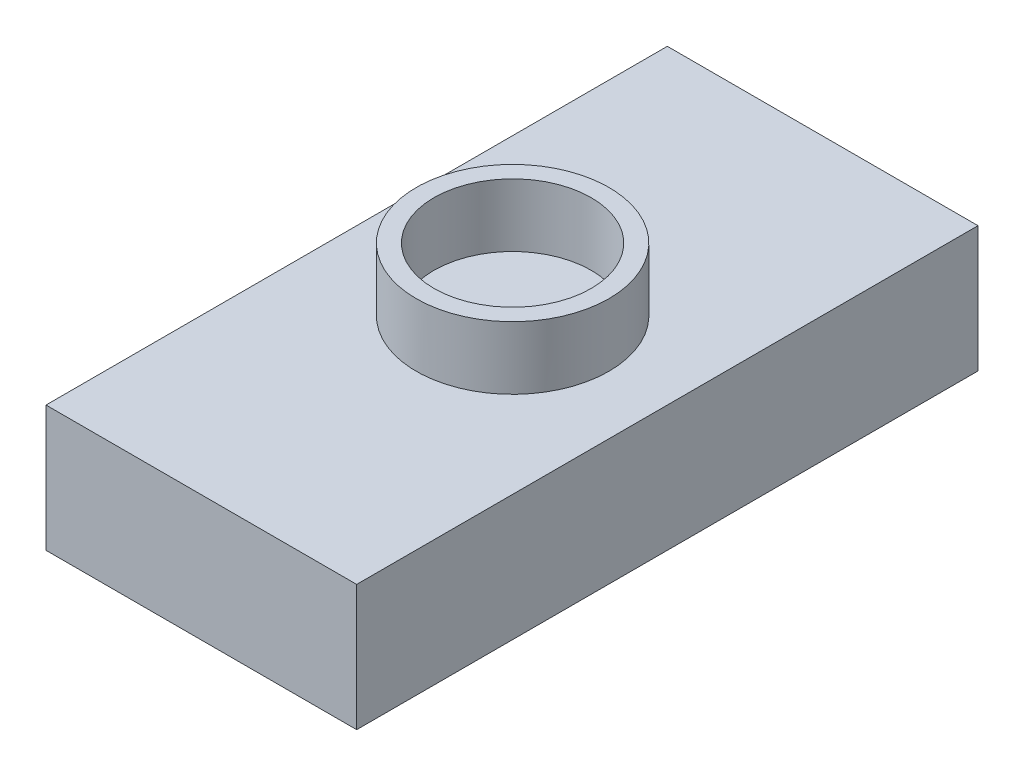
ISO-10303-21;
HEADER;
FILE_DESCRIPTION(('STEP AP214'),'2;1');
FILE_NAME('part.step','',(''),(''),'','','');
FILE_SCHEMA(('AUTOMOTIVE_DESIGN { 1 0 10303 214 1 1 1 1 }'));
ENDSEC;
DATA;
#1=APPLICATION_CONTEXT('core data for automotive mechanical design processes');
#2=APPLICATION_PROTOCOL_DEFINITION('international standard','automotive_design',2000,#1);
#3=PRODUCT_CONTEXT('',#1,'mechanical');
#4=PRODUCT('Part','Part','',(#3));
#5=PRODUCT_RELATED_PRODUCT_CATEGORY('part','',(#4));
#6=PRODUCT_DEFINITION_FORMATION('','',#4);
#7=PRODUCT_DEFINITION_CONTEXT('part definition',#1,'design');
#8=PRODUCT_DEFINITION('design','',#6,#7);
#9=PRODUCT_DEFINITION_SHAPE('','',#8);
#10=(LENGTH_UNIT() NAMED_UNIT(*) SI_UNIT(.MILLI.,.METRE.));
#11=(NAMED_UNIT(*) PLANE_ANGLE_UNIT() SI_UNIT($,.RADIAN.));
#12=(NAMED_UNIT(*) SI_UNIT($,.STERADIAN.) SOLID_ANGLE_UNIT());
#13=UNCERTAINTY_MEASURE_WITH_UNIT(LENGTH_MEASURE(1.E-05),#10,'distance_accuracy_value','');
#14=(GEOMETRIC_REPRESENTATION_CONTEXT(3) GLOBAL_UNCERTAINTY_ASSIGNED_CONTEXT((#13)) GLOBAL_UNIT_ASSIGNED_CONTEXT((#10,
#11,#12)) REPRESENTATION_CONTEXT('',''));
#15=CARTESIAN_POINT('',(0.,0.,0.));
#16=DIRECTION('',(0.,0.,1.));
#17=DIRECTION('',(1.,0.,0.));
#18=AXIS2_PLACEMENT_3D('',#15,#16,#17);
#19=CARTESIAN_POINT('',(1.88196721311474,0.,7.9));
#20=DIRECTION('',(1.,0.,0.));
#21=DIRECTION('',(0.,0.,-1.));
#22=AXIS2_PLACEMENT_3D('',#19,#20,#21);
#23=PLANE('',#22);
#24=DIRECTION('',(0.,0.,-1.));
#25=VECTOR('',#24,1.);
#26=CARTESIAN_POINT('',(1.88196721311474,0.2,1.95281131842795));
#27=LINE('',#26,#25);
#28=CARTESIAN_POINT('',(1.88196721311474,0.2,2.94718868157205));
#29=VERTEX_POINT('',#28);
#30=CARTESIAN_POINT('',(1.88196721311474,0.2,1.95281131842795));
#31=VERTEX_POINT('',#30);
#32=EDGE_CURVE('E280',#29,#31,#27,.T.);
#33=ORIENTED_EDGE('',*,*,#32,.F.);
#34=DIRECTION('',(0.,1.,0.));
#35=VECTOR('',#34,1.);
#36=CARTESIAN_POINT('',(1.88196721311474,0.2,2.94718868157205));
#37=LINE('',#36,#35);
#38=CARTESIAN_POINT('',(1.88196721311474,2.,2.94718868157205));
#39=VERTEX_POINT('',#38);
#40=EDGE_CURVE('E261',#29,#39,#37,.T.);
#41=ORIENTED_EDGE('',*,*,#40,.T.);
#42=DIRECTION('',(0.,0.,-1.));
#43=VECTOR('',#42,1.);
#44=CARTESIAN_POINT('',(1.88196721311474,2.,7.9));
#45=LINE('',#44,#43);
#46=CARTESIAN_POINT('',(1.88196721311474,2.,6.7));
#47=VERTEX_POINT('',#46);
#48=EDGE_CURVE('E335',#47,#39,#45,.T.);
#49=ORIENTED_EDGE('',*,*,#48,.F.);
#50=DIRECTION('',(0.,-1.,0.));
#51=VECTOR('',#50,1.);
#52=CARTESIAN_POINT('',(1.88196721311474,0.,6.7));
#53=LINE('',#52,#51);
#54=CARTESIAN_POINT('',(1.88196721311474,0.,6.7));
#55=VERTEX_POINT('',#54);
#56=EDGE_CURVE('E331',#47,#55,#53,.T.);
#57=ORIENTED_EDGE('',*,*,#56,.T.);
#58=DIRECTION('',(0.,0.,-1.));
#59=VECTOR('',#58,1.);
#60=CARTESIAN_POINT('',(1.88196721311474,0.,7.9));
#61=LINE('',#60,#59);
#62=CARTESIAN_POINT('',(1.88196721311474,0.,-6.7));
#63=VERTEX_POINT('',#62);
#64=EDGE_CURVE('E355',#55,#63,#61,.T.);
#65=ORIENTED_EDGE('',*,*,#64,.T.);
#66=DIRECTION('',(0.,-1.,0.));
#67=VECTOR('',#66,1.);
#68=CARTESIAN_POINT('',(1.88196721311474,0.,-6.7));
#69=LINE('',#68,#67);
#70=CARTESIAN_POINT('',(1.88196721311474,2.,-6.7));
#71=VERTEX_POINT('',#70);
#72=EDGE_CURVE('E327',#71,#63,#69,.T.);
#73=ORIENTED_EDGE('',*,*,#72,.F.);
#74=CARTESIAN_POINT('',(1.88196721311474,2.,-2.94718868157205));
#75=VERTEX_POINT('',#74);
#76=EDGE_CURVE('E340',#75,#71,#45,.T.);
#77=ORIENTED_EDGE('',*,*,#76,.F.);
#78=DIRECTION('',(0.,1.,0.));
#79=VECTOR('',#78,1.);
#80=CARTESIAN_POINT('',(1.88196721311474,0.2,-2.94718868157205));
#81=LINE('',#80,#79);
#82=CARTESIAN_POINT('',(1.88196721311474,0.2,-2.94718868157205));
#83=VERTEX_POINT('',#82);
#84=EDGE_CURVE('E549',#83,#75,#81,.T.);
#85=ORIENTED_EDGE('',*,*,#84,.F.);
#86=DIRECTION('',(0.,0.,-1.));
#87=VECTOR('',#86,1.);
#88=CARTESIAN_POINT('',(1.88196721311474,0.2,-1.95281131842795));
#89=LINE('',#88,#87);
#90=CARTESIAN_POINT('',(1.88196721311474,0.2,-1.95281131842795));
#91=VERTEX_POINT('',#90);
#92=EDGE_CURVE('E257',#91,#83,#89,.T.);
#93=ORIENTED_EDGE('',*,*,#92,.F.);
#94=DIRECTION('',(0.,1.,0.));
#95=VECTOR('',#94,1.);
#96=CARTESIAN_POINT('',(1.88196721311474,0.2,-1.95281131842795));
#97=LINE('',#96,#95);
#98=CARTESIAN_POINT('',(1.88196721311474,2.,-1.95281131842795));
#99=VERTEX_POINT('',#98);
#100=EDGE_CURVE('E545',#91,#99,#97,.T.);
#101=ORIENTED_EDGE('',*,*,#100,.T.);
#102=CARTESIAN_POINT('',(1.88196721311474,2.,1.95281131842795));
#103=VERTEX_POINT('',#102);
#104=EDGE_CURVE('E339',#103,#99,#45,.T.);
#105=ORIENTED_EDGE('',*,*,#104,.F.);
#106=DIRECTION('',(0.,1.,0.));
#107=VECTOR('',#106,1.);
#108=CARTESIAN_POINT('',(1.88196721311474,0.2,1.95281131842795));
#109=LINE('',#108,#107);
#110=EDGE_CURVE('E264',#31,#103,#109,.T.);
#111=ORIENTED_EDGE('',*,*,#110,.F.);
#112=EDGE_LOOP('',(#33,#41,#49,#57,#65,#73,#77,#85,#93,#101,#105,#111));
#113=FACE_BOUND('',#112,.T.);
#114=ADVANCED_FACE('F41',(#113),#23,.T.);
#115=CARTESIAN_POINT('',(7.38196721311474,0.,7.9));
#116=DIRECTION('',(-1.,0.,0.));
#117=DIRECTION('',(0.,0.,1.));
#118=AXIS2_PLACEMENT_3D('',#115,#116,#117);
#119=PLANE('',#118);
#120=DIRECTION('',(0.,0.,1.));
#121=VECTOR('',#120,1.);
#122=CARTESIAN_POINT('',(7.38196721311474,0.2,-1.95281131842795));
#123=LINE('',#122,#121);
#124=CARTESIAN_POINT('',(7.38196721311474,0.2,-2.94718868157205));
#125=VERTEX_POINT('',#124);
#126=CARTESIAN_POINT('',(7.38196721311474,0.2,-1.95281131842795));
#127=VERTEX_POINT('',#126);
#128=EDGE_CURVE('E301',#125,#127,#123,.T.);
#129=ORIENTED_EDGE('',*,*,#128,.F.);
#130=DIRECTION('',(0.,1.,0.));
#131=VECTOR('',#130,1.);
#132=CARTESIAN_POINT('',(7.38196721311474,0.2,-2.94718868157205));
#133=LINE('',#132,#131);
#134=CARTESIAN_POINT('',(7.38196721311474,2.,-2.94718868157205));
#135=VERTEX_POINT('',#134);
#136=EDGE_CURVE('E287',#125,#135,#133,.T.);
#137=ORIENTED_EDGE('',*,*,#136,.T.);
#138=DIRECTION('',(0.,0.,-1.));
#139=VECTOR('',#138,1.);
#140=CARTESIAN_POINT('',(7.38196721311474,2.,7.9));
#141=LINE('',#140,#139);
#142=CARTESIAN_POINT('',(7.38196721311474,2.,-6.7));
#143=VERTEX_POINT('',#142);
#144=EDGE_CURVE('E338',#135,#143,#141,.T.);
#145=ORIENTED_EDGE('',*,*,#144,.T.);
#146=DIRECTION('',(0.,1.,0.));
#147=VECTOR('',#146,1.);
#148=CARTESIAN_POINT('',(7.38196721311474,0.,-6.7));
#149=LINE('',#148,#147);
#150=CARTESIAN_POINT('',(7.38196721311474,0.,-6.7));
#151=VERTEX_POINT('',#150);
#152=EDGE_CURVE('E343',#151,#143,#149,.T.);
#153=ORIENTED_EDGE('',*,*,#152,.F.);
#154=DIRECTION('',(0.,0.,-1.));
#155=VECTOR('',#154,1.);
#156=CARTESIAN_POINT('',(7.38196721311474,0.,7.9));
#157=LINE('',#156,#155);
#158=CARTESIAN_POINT('',(7.38196721311474,0.,6.7));
#159=VERTEX_POINT('',#158);
#160=EDGE_CURVE('E350',#159,#151,#157,.T.);
#161=ORIENTED_EDGE('',*,*,#160,.F.);
#162=DIRECTION('',(0.,1.,0.));
#163=VECTOR('',#162,1.);
#164=CARTESIAN_POINT('',(7.38196721311474,0.,6.7));
#165=LINE('',#164,#163);
#166=CARTESIAN_POINT('',(7.38196721311474,2.,6.7));
#167=VERTEX_POINT('',#166);
#168=EDGE_CURVE('E346',#159,#167,#165,.T.);
#169=ORIENTED_EDGE('',*,*,#168,.T.);
#170=CARTESIAN_POINT('',(7.38196721311474,2.,2.94718868157205));
#171=VERTEX_POINT('',#170);
#172=EDGE_CURVE('E347',#167,#171,#141,.T.);
#173=ORIENTED_EDGE('',*,*,#172,.T.);
#174=DIRECTION('',(0.,1.,0.));
#175=VECTOR('',#174,1.);
#176=CARTESIAN_POINT('',(7.38196721311474,0.2,2.94718868157205));
#177=LINE('',#176,#175);
#178=CARTESIAN_POINT('',(7.38196721311474,0.2,2.94718868157205));
#179=VERTEX_POINT('',#178);
#180=EDGE_CURVE('E319',#179,#171,#177,.T.);
#181=ORIENTED_EDGE('',*,*,#180,.F.);
#182=DIRECTION('',(0.,0.,1.));
#183=VECTOR('',#182,1.);
#184=CARTESIAN_POINT('',(7.38196721311474,0.2,1.95281131842795));
#185=LINE('',#184,#183);
#186=CARTESIAN_POINT('',(7.38196721311474,0.2,1.95281131842795));
#187=VERTEX_POINT('',#186);
#188=EDGE_CURVE('E308',#187,#179,#185,.T.);
#189=ORIENTED_EDGE('',*,*,#188,.F.);
#190=DIRECTION('',(0.,1.,0.));
#191=VECTOR('',#190,1.);
#192=CARTESIAN_POINT('',(7.38196721311474,0.2,1.95281131842795));
#193=LINE('',#192,#191);
#194=CARTESIAN_POINT('',(7.38196721311474,2.,1.95281131842795));
#195=VERTEX_POINT('',#194);
#196=EDGE_CURVE('E321',#187,#195,#193,.T.);
#197=ORIENTED_EDGE('',*,*,#196,.T.);
#198=CARTESIAN_POINT('',(7.38196721311474,2.,-1.95281131842795));
#199=VERTEX_POINT('',#198);
#200=EDGE_CURVE('E351',#195,#199,#141,.T.);
#201=ORIENTED_EDGE('',*,*,#200,.T.);
#202=DIRECTION('',(0.,1.,0.));
#203=VECTOR('',#202,1.);
#204=CARTESIAN_POINT('',(7.38196721311474,0.2,-1.95281131842795));
#205=LINE('',#204,#203);
#206=EDGE_CURVE('E291',#127,#199,#205,.T.);
#207=ORIENTED_EDGE('',*,*,#206,.F.);
#208=EDGE_LOOP('',(#129,#137,#145,#153,#161,#169,#173,#181,#189,#197,#201,#207));
#209=FACE_BOUND('',#208,.T.);
#210=ADVANCED_FACE('F444',(#209),#119,.T.);
#211=CARTESIAN_POINT('',(0.681967213114738,2.,7.9));
#212=DIRECTION('',(0.,-1.,0.));
#213=DIRECTION('',(1.,0.,0.));
#214=AXIS2_PLACEMENT_3D('',#211,#212,#213);
#215=PLANE('',#214);
#216=ORIENTED_EDGE('',*,*,#144,.F.);
#217=DIRECTION('',(-1.,0.,0.));
#218=VECTOR('',#217,1.);
#219=CARTESIAN_POINT('',(0.681967213114738,2.,-2.94718868157205));
#220=LINE('',#219,#218);
#221=CARTESIAN_POINT('',(7.18196721311474,2.,-2.94718868157205));
#222=VERTEX_POINT('',#221);
#223=EDGE_CURVE('E49',#135,#222,#220,.T.);
#224=ORIENTED_EDGE('',*,*,#223,.T.);
#225=DIRECTION('',(-0.708052766446835,0.,0.706159528666847));
#226=VECTOR('',#225,1.);
#227=CARTESIAN_POINT('',(-1.50030936808936,2.,5.71187266085496));
#228=LINE('',#227,#226);
#229=CARTESIAN_POINT('',(6.68344555173073,2.,-2.45));
#230=VERTEX_POINT('',#229);
#231=EDGE_CURVE('E431',#222,#230,#228,.T.);
#232=ORIENTED_EDGE('',*,*,#231,.T.);
#233=DIRECTION('',(0.708052766446835,0.,0.706159528666847));
#234=VECTOR('',#233,1.);
#235=CARTESIAN_POINT('',(8.84965353389547,2.,-0.289584166366399));
#236=LINE('',#235,#234);
#237=CARTESIAN_POINT('',(7.18196721311474,2.,-1.95281131842795));
#238=VERTEX_POINT('',#237);
#239=EDGE_CURVE('E425',#230,#238,#236,.T.);
#240=ORIENTED_EDGE('',*,*,#239,.T.);
#241=DIRECTION('',(1.,0.,0.));
#242=VECTOR('',#241,1.);
#243=CARTESIAN_POINT('',(0.68196721311476,2.,-1.95281131842796));
#244=LINE('',#243,#242);
#245=EDGE_CURVE('E428',#238,#199,#244,.T.);
#246=ORIENTED_EDGE('',*,*,#245,.T.);
#247=ORIENTED_EDGE('',*,*,#200,.F.);
#248=DIRECTION('',(-1.,0.,0.));
#249=VECTOR('',#248,1.);
#250=CARTESIAN_POINT('',(0.681967213114725,2.,1.95281131842797));
#251=LINE('',#250,#249);
#252=CARTESIAN_POINT('',(7.18196721311474,2.,1.95281131842795));
#253=VERTEX_POINT('',#252);
#254=EDGE_CURVE('E401',#195,#253,#251,.T.);
#255=ORIENTED_EDGE('',*,*,#254,.T.);
#256=DIRECTION('',(-0.708052766446835,0.,0.706159528666847));
#257=VECTOR('',#256,1.);
#258=CARTESIAN_POINT('',(0.949681850254876,2.,8.16843238921274));
#259=LINE('',#258,#257);
#260=CARTESIAN_POINT('',(6.68344555173073,2.,2.45));
#261=VERTEX_POINT('',#260);
#262=EDGE_CURVE('E398',#253,#261,#259,.T.);
#263=ORIENTED_EDGE('',*,*,#262,.T.);
#264=DIRECTION('',(0.708052766446835,0.,0.706159528666847));
#265=VECTOR('',#264,1.);
#266=CARTESIAN_POINT('',(6.39966231555123,2.,2.16697556199138));
#267=LINE('',#266,#265);
#268=CARTESIAN_POINT('',(7.18196721311474,2.,2.94718868157205));
#269=VERTEX_POINT('',#268);
#270=EDGE_CURVE('E392',#261,#269,#267,.T.);
#271=ORIENTED_EDGE('',*,*,#270,.T.);
#272=DIRECTION('',(1.,0.,0.));
#273=VECTOR('',#272,1.);
#274=CARTESIAN_POINT('',(0.681967213114738,2.,2.94718868157205));
#275=LINE('',#274,#273);
#276=EDGE_CURVE('E395',#269,#171,#275,.T.);
#277=ORIENTED_EDGE('',*,*,#276,.T.);
#278=ORIENTED_EDGE('',*,*,#172,.F.);
#279=DIRECTION('',(-1.,0.,0.));
#280=VECTOR('',#279,1.);
#281=CARTESIAN_POINT('',(0.,2.,6.7));
#282=LINE('',#281,#280);
#283=EDGE_CURVE('E344',#167,#47,#282,.T.);
#284=ORIENTED_EDGE('',*,*,#283,.T.);
#285=ORIENTED_EDGE('',*,*,#48,.T.);
#286=DIRECTION('',(1.,0.,0.));
#287=VECTOR('',#286,1.);
#288=CARTESIAN_POINT('',(0.681967213114738,2.,2.94718868157205));
#289=LINE('',#288,#287);
#290=CARTESIAN_POINT('',(2.08196721311474,2.,2.94718868157205));
#291=VERTEX_POINT('',#290);
#292=EDGE_CURVE('E422',#39,#291,#289,.T.);
#293=ORIENTED_EDGE('',*,*,#292,.T.);
#294=DIRECTION('',(0.708052766446835,0.,-0.706159528666847));
#295=VECTOR('',#294,1.);
#296=CARTESIAN_POINT('',(-1.09630377789859,2.,6.11696140381168));
#297=LINE('',#296,#295);
#298=CARTESIAN_POINT('',(2.58048887449875,2.,2.45));
#299=VERTEX_POINT('',#298);
#300=EDGE_CURVE('E413',#291,#299,#297,.T.);
#301=ORIENTED_EDGE('',*,*,#300,.T.);
#302=DIRECTION('',(-0.708052766446835,0.,-0.706159528666847));
#303=VECTOR('',#302,1.);
#304=CARTESIAN_POINT('',(4.35367668739777,2.,4.21844654739244));
#305=LINE('',#304,#303);
#306=CARTESIAN_POINT('',(2.08196721311474,2.,1.95281131842795));
#307=VERTEX_POINT('',#306);
#308=EDGE_CURVE('E416',#299,#307,#305,.T.);
#309=ORIENTED_EDGE('',*,*,#308,.T.);
#310=DIRECTION('',(-1.,0.,0.));
#311=VECTOR('',#310,1.);
#312=CARTESIAN_POINT('',(0.681967213114751,2.,1.95281131842795));
#313=LINE('',#312,#311);
#314=EDGE_CURVE('E419',#307,#103,#313,.T.);
#315=ORIENTED_EDGE('',*,*,#314,.T.);
#316=ORIENTED_EDGE('',*,*,#104,.T.);
#317=DIRECTION('',(1.,0.,0.));
#318=VECTOR('',#317,1.);
#319=CARTESIAN_POINT('',(0.681967213114717,2.,-1.95281131842795));
#320=LINE('',#319,#318);
#321=CARTESIAN_POINT('',(2.08196721311474,2.,-1.95281131842795));
#322=VERTEX_POINT('',#321);
#323=EDGE_CURVE('E410',#99,#322,#320,.T.);
#324=ORIENTED_EDGE('',*,*,#323,.T.);
#325=DIRECTION('',(0.708052766446835,0.,-0.706159528666847));
#326=VECTOR('',#325,1.);
#327=CARTESIAN_POINT('',(-3.54629499624283,2.,3.6604016754539));
#328=LINE('',#327,#326);
#329=CARTESIAN_POINT('',(2.58048887449875,2.,-2.45));
#330=VERTEX_POINT('',#329);
#331=EDGE_CURVE('E408',#322,#330,#328,.T.);
#332=ORIENTED_EDGE('',*,*,#331,.T.);
#333=DIRECTION('',(-0.708052766446835,0.,-0.706159528666847));
#334=VECTOR('',#333,1.);
#335=CARTESIAN_POINT('',(6.80366790574201,2.,1.76188681903466));
#336=LINE('',#335,#334);
#337=CARTESIAN_POINT('',(2.08196721311474,2.,-2.94718868157205));
#338=VERTEX_POINT('',#337);
#339=EDGE_CURVE('E243',#330,#338,#336,.T.);
#340=ORIENTED_EDGE('',*,*,#339,.T.);
#341=DIRECTION('',(-1.,0.,0.));
#342=VECTOR('',#341,1.);
#343=CARTESIAN_POINT('',(0.681967213114738,2.,-2.94718868157205));
#344=LINE('',#343,#342);
#345=EDGE_CURVE('E405',#338,#75,#344,.T.);
#346=ORIENTED_EDGE('',*,*,#345,.T.);
#347=ORIENTED_EDGE('',*,*,#76,.T.);
#348=DIRECTION('',(-1.,0.,0.));
#349=VECTOR('',#348,1.);
#350=CARTESIAN_POINT('',(0.,2.,-6.7));
#351=LINE('',#350,#349);
#352=EDGE_CURVE('E334',#143,#71,#351,.T.);
#353=ORIENTED_EDGE('',*,*,#352,.F.);
#354=EDGE_LOOP('',(#216,#224,#232,#240,#246,#247,#255,#263,#271,#277,#278,#284,#285,#293,#301,
#309,#315,#316,#324,#332,#340,#346,#347,#353));
#355=FACE_BOUND('',#354,.T.);
#356=ADVANCED_FACE('F436',(#355),#215,.T.);
#357=CARTESIAN_POINT('',(0.681967213114738,0.,7.9));
#358=DIRECTION('',(0.,1.,0.));
#359=DIRECTION('',(0.,0.,1.));
#360=AXIS2_PLACEMENT_3D('',#357,#358,#359);
#361=PLANE('',#360);
#362=DIRECTION('',(1.,0.,0.));
#363=VECTOR('',#362,1.);
#364=CARTESIAN_POINT('',(0.681967213114738,0.,-7.9));
#365=LINE('',#364,#363);
#366=CARTESIAN_POINT('',(0.681967213114738,0.,-7.9));
#367=VERTEX_POINT('',#366);
#368=CARTESIAN_POINT('',(8.58196721311474,0.,-7.9));
#369=VERTEX_POINT('',#368);
#370=EDGE_CURVE('E376',#367,#369,#365,.T.);
#371=ORIENTED_EDGE('',*,*,#370,.T.);
#372=DIRECTION('',(0.,0.,-1.));
#373=VECTOR('',#372,1.);
#374=CARTESIAN_POINT('',(8.58196721311474,0.,7.9));
#375=LINE('',#374,#373);
#376=CARTESIAN_POINT('',(8.58196721311474,0.,7.9));
#377=VERTEX_POINT('',#376);
#378=EDGE_CURVE('E386',#377,#369,#375,.T.);
#379=ORIENTED_EDGE('',*,*,#378,.F.);
#380=DIRECTION('',(1.,0.,0.));
#381=VECTOR('',#380,1.);
#382=CARTESIAN_POINT('',(0.681967213114738,0.,7.9));
#383=LINE('',#382,#381);
#384=CARTESIAN_POINT('',(0.681967213114738,0.,7.9));
#385=VERTEX_POINT('',#384);
#386=EDGE_CURVE('E366',#385,#377,#383,.T.);
#387=ORIENTED_EDGE('',*,*,#386,.F.);
#388=DIRECTION('',(0.,0.,-1.));
#389=VECTOR('',#388,1.);
#390=CARTESIAN_POINT('',(0.681967213114738,0.,7.9));
#391=LINE('',#390,#389);
#392=EDGE_CURVE('E389',#385,#367,#391,.T.);
#393=ORIENTED_EDGE('',*,*,#392,.T.);
#394=EDGE_LOOP('',(#371,#379,#387,#393));
#395=FACE_BOUND('',#394,.T.);
#396=DIRECTION('',(1.,0.,0.));
#397=VECTOR('',#396,1.);
#398=CARTESIAN_POINT('',(0.,0.,-6.7));
#399=LINE('',#398,#397);
#400=EDGE_CURVE('E330',#63,#151,#399,.T.);
#401=ORIENTED_EDGE('',*,*,#400,.F.);
#402=ORIENTED_EDGE('',*,*,#64,.F.);
#403=DIRECTION('',(1.,0.,0.));
#404=VECTOR('',#403,1.);
#405=CARTESIAN_POINT('',(0.,0.,6.7));
#406=LINE('',#405,#404);
#407=EDGE_CURVE('E333',#55,#159,#406,.T.);
#408=ORIENTED_EDGE('',*,*,#407,.T.);
#409=ORIENTED_EDGE('',*,*,#160,.T.);
#410=EDGE_LOOP('',(#401,#402,#408,#409));
#411=FACE_BOUND('',#410,.T.);
#412=ADVANCED_FACE('F485',(#395,#411),#361,.F.);
#413=CARTESIAN_POINT('',(0.681967213114738,0.,7.9));
#414=DIRECTION('',(1.,0.,0.));
#415=DIRECTION('',(0.,0.,-1.));
#416=AXIS2_PLACEMENT_3D('',#413,#414,#415);
#417=PLANE('',#416);
#418=DIRECTION('',(0.,-1.,0.));
#419=VECTOR('',#418,1.);
#420=CARTESIAN_POINT('',(0.681967213114738,0.,-7.9));
#421=LINE('',#420,#419);
#422=CARTESIAN_POINT('',(0.681967213114738,3.2,-7.9));
#423=VERTEX_POINT('',#422);
#424=EDGE_CURVE('E357',#423,#367,#421,.T.);
#425=ORIENTED_EDGE('',*,*,#424,.T.);
#426=ORIENTED_EDGE('',*,*,#392,.F.);
#427=DIRECTION('',(0.,-1.,0.));
#428=VECTOR('',#427,1.);
#429=CARTESIAN_POINT('',(0.681967213114738,0.,7.9));
#430=LINE('',#429,#428);
#431=CARTESIAN_POINT('',(0.681967213114738,3.2,7.9));
#432=VERTEX_POINT('',#431);
#433=EDGE_CURVE('E363',#432,#385,#430,.T.);
#434=ORIENTED_EDGE('',*,*,#433,.F.);
#435=DIRECTION('',(0.,0.,-1.));
#436=VECTOR('',#435,1.);
#437=CARTESIAN_POINT('',(0.681967213114738,3.2,7.9));
#438=LINE('',#437,#436);
#439=EDGE_CURVE('E373',#432,#423,#438,.T.);
#440=ORIENTED_EDGE('',*,*,#439,.T.);
#441=EDGE_LOOP('',(#425,#426,#434,#440));
#442=FACE_BOUND('',#441,.T.);
#443=ADVANCED_FACE('F43',(#442),#417,.F.);
#444=CARTESIAN_POINT('',(8.58196721311474,0.,7.9));
#445=DIRECTION('',(-1.,0.,0.));
#446=DIRECTION('',(0.,0.,1.));
#447=AXIS2_PLACEMENT_3D('',#444,#445,#446);
#448=PLANE('',#447);
#449=DIRECTION('',(0.,1.,0.));
#450=VECTOR('',#449,1.);
#451=CARTESIAN_POINT('',(8.58196721311474,0.,-7.9));
#452=LINE('',#451,#450);
#453=CARTESIAN_POINT('',(8.58196721311474,3.2,-7.9));
#454=VERTEX_POINT('',#453);
#455=EDGE_CURVE('E378',#369,#454,#452,.T.);
#456=ORIENTED_EDGE('',*,*,#455,.T.);
#457=DIRECTION('',(0.,0.,-1.));
#458=VECTOR('',#457,1.);
#459=CARTESIAN_POINT('',(8.58196721311474,3.2,7.9));
#460=LINE('',#459,#458);
#461=CARTESIAN_POINT('',(8.58196721311474,3.2,7.9));
#462=VERTEX_POINT('',#461);
#463=EDGE_CURVE('E383',#462,#454,#460,.T.);
#464=ORIENTED_EDGE('',*,*,#463,.F.);
#465=DIRECTION('',(0.,1.,0.));
#466=VECTOR('',#465,1.);
#467=CARTESIAN_POINT('',(8.58196721311474,0.,7.9));
#468=LINE('',#467,#466);
#469=EDGE_CURVE('E369',#377,#462,#468,.T.);
#470=ORIENTED_EDGE('',*,*,#469,.F.);
#471=ORIENTED_EDGE('',*,*,#378,.T.);
#472=EDGE_LOOP('',(#456,#464,#470,#471));
#473=FACE_BOUND('',#472,.T.);
#474=ADVANCED_FACE('F505',(#473),#448,.F.);
#475=CARTESIAN_POINT('',(0.681967213114738,3.2,7.9));
#476=DIRECTION('',(0.,-1.,0.));
#477=DIRECTION('',(1.,0.,0.));
#478=AXIS2_PLACEMENT_3D('',#475,#476,#477);
#479=PLANE('',#478);
#480=CARTESIAN_POINT('',(4.64733561896666,3.2,0.));
#481=DIRECTION('',(0.,-1.,0.));
#482=DIRECTION('',(1.,0.,0.));
#483=AXIS2_PLACEMENT_3D('',#480,#481,#482);
#484=CIRCLE('',#483,2.45);
#485=CARTESIAN_POINT('',(7.09733561896666,3.2,0.));
#486=VERTEX_POINT('',#485);
#487=EDGE_CURVE('E11',#486,#486,#484,.F.);
#488=ORIENTED_EDGE('',*,*,#487,.F.);
#489=EDGE_LOOP('',(#488));
#490=FACE_BOUND('',#489,.T.);
#491=DIRECTION('',(-1.,0.,0.));
#492=VECTOR('',#491,1.);
#493=CARTESIAN_POINT('',(0.681967213114738,3.2,-7.9));
#494=LINE('',#493,#492);
#495=EDGE_CURVE('E367',#454,#423,#494,.T.);
#496=ORIENTED_EDGE('',*,*,#495,.T.);
#497=ORIENTED_EDGE('',*,*,#439,.F.);
#498=DIRECTION('',(-1.,0.,0.));
#499=VECTOR('',#498,1.);
#500=CARTESIAN_POINT('',(0.681967213114738,3.2,7.9));
#501=LINE('',#500,#499);
#502=EDGE_CURVE('E371',#462,#432,#501,.T.);
#503=ORIENTED_EDGE('',*,*,#502,.F.);
#504=ORIENTED_EDGE('',*,*,#463,.T.);
#505=EDGE_LOOP('',(#496,#497,#503,#504));
#506=FACE_BOUND('',#505,.T.);
#507=ADVANCED_FACE('F498',(#490,#506),#479,.F.);
#508=CARTESIAN_POINT('',(0.,0.,7.9));
#509=DIRECTION('',(0.,0.,-1.));
#510=DIRECTION('',(-1.,0.,0.));
#511=AXIS2_PLACEMENT_3D('',#508,#509,#510);
#512=PLANE('',#511);
#513=ORIENTED_EDGE('',*,*,#433,.T.);
#514=ORIENTED_EDGE('',*,*,#386,.T.);
#515=ORIENTED_EDGE('',*,*,#469,.T.);
#516=ORIENTED_EDGE('',*,*,#502,.T.);
#517=EDGE_LOOP('',(#513,#514,#515,#516));
#518=FACE_BOUND('',#517,.T.);
#519=ADVANCED_FACE('F495',(#518),#512,.F.);
#520=CARTESIAN_POINT('',(0.,0.,-7.9));
#521=DIRECTION('',(0.,0.,-1.));
#522=DIRECTION('',(-1.,0.,0.));
#523=AXIS2_PLACEMENT_3D('',#520,#521,#522);
#524=PLANE('',#523);
#525=ORIENTED_EDGE('',*,*,#424,.F.);
#526=ORIENTED_EDGE('',*,*,#495,.F.);
#527=ORIENTED_EDGE('',*,*,#455,.F.);
#528=ORIENTED_EDGE('',*,*,#370,.F.);
#529=EDGE_LOOP('',(#525,#526,#527,#528));
#530=FACE_BOUND('',#529,.T.);
#531=ADVANCED_FACE('F490',(#530),#524,.T.);
#532=CARTESIAN_POINT('',(0.,0.,6.7));
#533=DIRECTION('',(0.,0.,-1.));
#534=DIRECTION('',(-1.,0.,0.));
#535=AXIS2_PLACEMENT_3D('',#532,#533,#534);
#536=PLANE('',#535);
#537=ORIENTED_EDGE('',*,*,#56,.F.);
#538=ORIENTED_EDGE('',*,*,#283,.F.);
#539=ORIENTED_EDGE('',*,*,#168,.F.);
#540=ORIENTED_EDGE('',*,*,#407,.F.);
#541=EDGE_LOOP('',(#537,#538,#539,#540));
#542=FACE_BOUND('',#541,.T.);
#543=ADVANCED_FACE('F486',(#542),#536,.T.);
#544=CARTESIAN_POINT('',(0.,0.,-6.7));
#545=DIRECTION('',(0.,0.,-1.));
#546=DIRECTION('',(-1.,0.,0.));
#547=AXIS2_PLACEMENT_3D('',#544,#545,#546);
#548=PLANE('',#547);
#549=ORIENTED_EDGE('',*,*,#72,.T.);
#550=ORIENTED_EDGE('',*,*,#400,.T.);
#551=ORIENTED_EDGE('',*,*,#152,.T.);
#552=ORIENTED_EDGE('',*,*,#352,.T.);
#553=EDGE_LOOP('',(#549,#550,#551,#552));
#554=FACE_BOUND('',#553,.T.);
#555=ADVANCED_FACE('F489',(#554),#548,.F.);
#556=CARTESIAN_POINT('',(6.68344555173073,0.2,2.45));
#557=DIRECTION('',(0.706159528666847,0.,0.708052766446835));
#558=DIRECTION('',(0.708052766446835,0.,-0.706159528666847));
#559=AXIS2_PLACEMENT_3D('',#556,#557,#558);
#560=PLANE('',#559);
#561=ORIENTED_EDGE('',*,*,#262,.F.);
#562=DIRECTION('',(0.,1.,0.));
#563=VECTOR('',#562,1.);
#564=CARTESIAN_POINT('',(7.18196721311474,0.2,1.95281131842795));
#565=LINE('',#564,#563);
#566=CARTESIAN_POINT('',(7.18196721311474,0.2,1.95281131842795));
#567=VERTEX_POINT('',#566);
#568=EDGE_CURVE('E324',#567,#253,#565,.T.);
#569=ORIENTED_EDGE('',*,*,#568,.F.);
#570=DIRECTION('',(0.708052766446835,0.,-0.706159528666847));
#571=VECTOR('',#570,1.);
#572=CARTESIAN_POINT('',(6.68344555173073,0.2,2.45));
#573=LINE('',#572,#571);
#574=CARTESIAN_POINT('',(6.68344555173073,0.2,2.45));
#575=VERTEX_POINT('',#574);
#576=EDGE_CURVE('E251',#575,#567,#573,.T.);
#577=ORIENTED_EDGE('',*,*,#576,.F.);
#578=DIRECTION('',(0.,1.,0.));
#579=VECTOR('',#578,1.);
#580=CARTESIAN_POINT('',(6.68344555173073,0.2,2.45));
#581=LINE('',#580,#579);
#582=EDGE_CURVE('E314',#575,#261,#581,.T.);
#583=ORIENTED_EDGE('',*,*,#582,.T.);
#584=EDGE_LOOP('',(#561,#569,#577,#583));
#585=FACE_BOUND('',#584,.T.);
#586=ADVANCED_FACE('F480',(#585),#560,.F.);
#587=CARTESIAN_POINT('',(7.38196721311474,0.2,1.95281131842795));
#588=DIRECTION('',(0.,0.,1.));
#589=DIRECTION('',(1.,0.,0.));
#590=AXIS2_PLACEMENT_3D('',#587,#588,#589);
#591=PLANE('',#590);
#592=ORIENTED_EDGE('',*,*,#254,.F.);
#593=ORIENTED_EDGE('',*,*,#196,.F.);
#594=DIRECTION('',(1.,0.,0.));
#595=VECTOR('',#594,1.);
#596=CARTESIAN_POINT('',(7.38196721311474,0.2,1.95281131842795));
#597=LINE('',#596,#595);
#598=EDGE_CURVE('E255',#567,#187,#597,.T.);
#599=ORIENTED_EDGE('',*,*,#598,.F.);
#600=ORIENTED_EDGE('',*,*,#568,.T.);
#601=EDGE_LOOP('',(#592,#593,#599,#600));
#602=FACE_BOUND('',#601,.T.);
#603=ADVANCED_FACE('F640',(#602),#591,.F.);
#604=CARTESIAN_POINT('',(7.38196721311474,0.2,2.94718868157205));
#605=DIRECTION('',(0.,0.,-1.));
#606=DIRECTION('',(-1.,0.,0.));
#607=AXIS2_PLACEMENT_3D('',#604,#605,#606);
#608=PLANE('',#607);
#609=ORIENTED_EDGE('',*,*,#276,.F.);
#610=DIRECTION('',(0.,1.,0.));
#611=VECTOR('',#610,1.);
#612=CARTESIAN_POINT('',(7.18196721311474,0.2,2.94718868157205));
#613=LINE('',#612,#611);
#614=CARTESIAN_POINT('',(7.18196721311474,0.2,2.94718868157205));
#615=VERTEX_POINT('',#614);
#616=EDGE_CURVE('E317',#615,#269,#613,.T.);
#617=ORIENTED_EDGE('',*,*,#616,.F.);
#618=DIRECTION('',(-1.,0.,0.));
#619=VECTOR('',#618,1.);
#620=CARTESIAN_POINT('',(7.38196721311474,0.2,2.94718868157205));
#621=LINE('',#620,#619);
#622=EDGE_CURVE('E310',#179,#615,#621,.T.);
#623=ORIENTED_EDGE('',*,*,#622,.F.);
#624=ORIENTED_EDGE('',*,*,#180,.T.);
#625=EDGE_LOOP('',(#609,#617,#623,#624));
#626=FACE_BOUND('',#625,.T.);
#627=ADVANCED_FACE('F649',(#626),#608,.F.);
#628=CARTESIAN_POINT('',(6.68344555173073,0.2,2.45));
#629=DIRECTION('',(0.706159528666847,0.,-0.708052766446835));
#630=DIRECTION('',(-0.708052766446835,0.,-0.706159528666847));
#631=AXIS2_PLACEMENT_3D('',#628,#629,#630);
#632=PLANE('',#631);
#633=ORIENTED_EDGE('',*,*,#270,.F.);
#634=ORIENTED_EDGE('',*,*,#582,.F.);
#635=DIRECTION('',(-0.708052766446835,0.,-0.706159528666847));
#636=VECTOR('',#635,1.);
#637=CARTESIAN_POINT('',(6.68344555173073,0.2,2.45));
#638=LINE('',#637,#636);
#639=EDGE_CURVE('E312',#615,#575,#638,.T.);
#640=ORIENTED_EDGE('',*,*,#639,.F.);
#641=ORIENTED_EDGE('',*,*,#616,.T.);
#642=EDGE_LOOP('',(#633,#634,#640,#641));
#643=FACE_BOUND('',#642,.T.);
#644=ADVANCED_FACE('F657',(#643),#632,.F.);
#645=CARTESIAN_POINT('',(0.,0.2,0.));
#646=DIRECTION('',(0.,-1.,0.));
#647=DIRECTION('',(0.,0.,-1.));
#648=AXIS2_PLACEMENT_3D('',#645,#646,#647);
#649=PLANE('',#648);
#650=ORIENTED_EDGE('',*,*,#576,.T.);
#651=ORIENTED_EDGE('',*,*,#598,.T.);
#652=ORIENTED_EDGE('',*,*,#188,.T.);
#653=ORIENTED_EDGE('',*,*,#622,.T.);
#654=ORIENTED_EDGE('',*,*,#639,.T.);
#655=EDGE_LOOP('',(#650,#651,#652,#653,#654));
#656=FACE_BOUND('',#655,.T.);
#657=ADVANCED_FACE('F587',(#656),#649,.T.);
#658=CARTESIAN_POINT('',(2.58048887449875,0.2,-2.45));
#659=DIRECTION('',(-0.706159528666847,0.,-0.708052766446835));
#660=DIRECTION('',(-0.708052766446835,0.,0.706159528666847));
#661=AXIS2_PLACEMENT_3D('',#658,#659,#660);
#662=PLANE('',#661);
#663=ORIENTED_EDGE('',*,*,#331,.F.);
#664=DIRECTION('',(0.,1.,0.));
#665=VECTOR('',#664,1.);
#666=CARTESIAN_POINT('',(2.08196721311474,0.2,-1.95281131842795));
#667=LINE('',#666,#665);
#668=CARTESIAN_POINT('',(2.08196721311474,0.2,-1.95281131842795));
#669=VERTEX_POINT('',#668);
#670=EDGE_CURVE('E250',#669,#322,#667,.T.);
#671=ORIENTED_EDGE('',*,*,#670,.F.);
#672=DIRECTION('',(-0.708052766446835,0.,0.706159528666847));
#673=VECTOR('',#672,1.);
#674=CARTESIAN_POINT('',(2.58048887449875,0.2,-2.45));
#675=LINE('',#674,#673);
#676=CARTESIAN_POINT('',(2.58048887449875,0.2,-2.45));
#677=VERTEX_POINT('',#676);
#678=EDGE_CURVE('E232',#677,#669,#675,.T.);
#679=ORIENTED_EDGE('',*,*,#678,.F.);
#680=DIRECTION('',(0.,1.,0.));
#681=VECTOR('',#680,1.);
#682=CARTESIAN_POINT('',(2.58048887449875,0.2,-2.45));
#683=LINE('',#682,#681);
#684=EDGE_CURVE('E238',#677,#330,#683,.T.);
#685=ORIENTED_EDGE('',*,*,#684,.T.);
#686=EDGE_LOOP('',(#663,#671,#679,#685));
#687=FACE_BOUND('',#686,.T.);
#688=ADVANCED_FACE('F248',(#687),#662,.F.);
#689=CARTESIAN_POINT('',(1.88196721311474,0.2,-1.95281131842795));
#690=DIRECTION('',(0.,0.,-1.));
#691=DIRECTION('',(-1.,0.,0.));
#692=AXIS2_PLACEMENT_3D('',#689,#690,#691);
#693=PLANE('',#692);
#694=ORIENTED_EDGE('',*,*,#323,.F.);
#695=ORIENTED_EDGE('',*,*,#100,.F.);
#696=DIRECTION('',(-1.,0.,0.));
#697=VECTOR('',#696,1.);
#698=CARTESIAN_POINT('',(1.88196721311474,0.2,-1.95281131842795));
#699=LINE('',#698,#697);
#700=EDGE_CURVE('E252',#669,#91,#699,.T.);
#701=ORIENTED_EDGE('',*,*,#700,.F.);
#702=ORIENTED_EDGE('',*,*,#670,.T.);
#703=EDGE_LOOP('',(#694,#695,#701,#702));
#704=FACE_BOUND('',#703,.T.);
#705=ADVANCED_FACE('F558',(#704),#693,.F.);
#706=CARTESIAN_POINT('',(1.88196721311474,0.2,-2.94718868157205));
#707=DIRECTION('',(0.,0.,1.));
#708=DIRECTION('',(1.,0.,0.));
#709=AXIS2_PLACEMENT_3D('',#706,#707,#708);
#710=PLANE('',#709);
#711=ORIENTED_EDGE('',*,*,#345,.F.);
#712=DIRECTION('',(0.,1.,0.));
#713=VECTOR('',#712,1.);
#714=CARTESIAN_POINT('',(2.08196721311474,0.2,-2.94718868157205));
#715=LINE('',#714,#713);
#716=CARTESIAN_POINT('',(2.08196721311474,0.2,-2.94718868157205));
#717=VERTEX_POINT('',#716);
#718=EDGE_CURVE('E246',#717,#338,#715,.T.);
#719=ORIENTED_EDGE('',*,*,#718,.F.);
#720=DIRECTION('',(1.,0.,0.));
#721=VECTOR('',#720,1.);
#722=CARTESIAN_POINT('',(1.88196721311474,0.2,-2.94718868157205));
#723=LINE('',#722,#721);
#724=EDGE_CURVE('E235',#83,#717,#723,.T.);
#725=ORIENTED_EDGE('',*,*,#724,.F.);
#726=ORIENTED_EDGE('',*,*,#84,.T.);
#727=EDGE_LOOP('',(#711,#719,#725,#726));
#728=FACE_BOUND('',#727,.T.);
#729=ADVANCED_FACE('F556',(#728),#710,.F.);
#730=CARTESIAN_POINT('',(2.58048887449875,0.2,-2.45));
#731=DIRECTION('',(-0.706159528666847,0.,0.708052766446835));
#732=DIRECTION('',(0.708052766446835,0.,0.706159528666847));
#733=AXIS2_PLACEMENT_3D('',#730,#731,#732);
#734=PLANE('',#733);
#735=ORIENTED_EDGE('',*,*,#339,.F.);
#736=ORIENTED_EDGE('',*,*,#684,.F.);
#737=DIRECTION('',(0.708052766446835,0.,0.706159528666847));
#738=VECTOR('',#737,1.);
#739=CARTESIAN_POINT('',(2.58048887449875,0.2,-2.45));
#740=LINE('',#739,#738);
#741=EDGE_CURVE('E228',#717,#677,#740,.T.);
#742=ORIENTED_EDGE('',*,*,#741,.F.);
#743=ORIENTED_EDGE('',*,*,#718,.T.);
#744=EDGE_LOOP('',(#735,#736,#742,#743));
#745=FACE_BOUND('',#744,.T.);
#746=ADVANCED_FACE('F241',(#745),#734,.F.);
#747=CARTESIAN_POINT('',(0.,0.2,0.));
#748=DIRECTION('',(0.,-1.,0.));
#749=DIRECTION('',(0.,0.,-1.));
#750=AXIS2_PLACEMENT_3D('',#747,#748,#749);
#751=PLANE('',#750);
#752=ORIENTED_EDGE('',*,*,#678,.T.);
#753=ORIENTED_EDGE('',*,*,#700,.T.);
#754=ORIENTED_EDGE('',*,*,#92,.T.);
#755=ORIENTED_EDGE('',*,*,#724,.T.);
#756=ORIENTED_EDGE('',*,*,#741,.T.);
#757=EDGE_LOOP('',(#752,#753,#754,#755,#756));
#758=FACE_BOUND('',#757,.T.);
#759=ADVANCED_FACE('F230',(#758),#751,.T.);
#760=CARTESIAN_POINT('',(1.88196721311474,0.2,2.94718868157205));
#761=DIRECTION('',(0.,0.,-1.));
#762=DIRECTION('',(-1.,0.,0.));
#763=AXIS2_PLACEMENT_3D('',#760,#761,#762);
#764=PLANE('',#763);
#765=ORIENTED_EDGE('',*,*,#292,.F.);
#766=ORIENTED_EDGE('',*,*,#40,.F.);
#767=DIRECTION('',(-1.,0.,0.));
#768=VECTOR('',#767,1.);
#769=CARTESIAN_POINT('',(1.88196721311474,0.2,2.94718868157205));
#770=LINE('',#769,#768);
#771=CARTESIAN_POINT('',(2.08196721311474,0.2,2.94718868157205));
#772=VERTEX_POINT('',#771);
#773=EDGE_CURVE('E282',#772,#29,#770,.T.);
#774=ORIENTED_EDGE('',*,*,#773,.F.);
#775=DIRECTION('',(0.,1.,0.));
#776=VECTOR('',#775,1.);
#777=CARTESIAN_POINT('',(2.08196721311474,0.2,2.94718868157205));
#778=LINE('',#777,#776);
#779=EDGE_CURVE('E271',#772,#291,#778,.T.);
#780=ORIENTED_EDGE('',*,*,#779,.T.);
#781=EDGE_LOOP('',(#765,#766,#774,#780));
#782=FACE_BOUND('',#781,.T.);
#783=ADVANCED_FACE('F531',(#782),#764,.F.);
#784=CARTESIAN_POINT('',(1.88196721311474,0.2,1.95281131842795));
#785=DIRECTION('',(0.,0.,1.));
#786=DIRECTION('',(1.,0.,0.));
#787=AXIS2_PLACEMENT_3D('',#784,#785,#786);
#788=PLANE('',#787);
#789=ORIENTED_EDGE('',*,*,#314,.F.);
#790=DIRECTION('',(0.,1.,0.));
#791=VECTOR('',#790,1.);
#792=CARTESIAN_POINT('',(2.08196721311474,0.2,1.95281131842795));
#793=LINE('',#792,#791);
#794=CARTESIAN_POINT('',(2.08196721311474,0.2,1.95281131842795));
#795=VERTEX_POINT('',#794);
#796=EDGE_CURVE('E267',#795,#307,#793,.T.);
#797=ORIENTED_EDGE('',*,*,#796,.F.);
#798=DIRECTION('',(1.,0.,0.));
#799=VECTOR('',#798,1.);
#800=CARTESIAN_POINT('',(1.88196721311474,0.2,1.95281131842795));
#801=LINE('',#800,#799);
#802=EDGE_CURVE('E278',#31,#795,#801,.T.);
#803=ORIENTED_EDGE('',*,*,#802,.F.);
#804=ORIENTED_EDGE('',*,*,#110,.T.);
#805=EDGE_LOOP('',(#789,#797,#803,#804));
#806=FACE_BOUND('',#805,.T.);
#807=ADVANCED_FACE('F539',(#806),#788,.F.);
#808=CARTESIAN_POINT('',(2.58048887449875,0.2,2.45));
#809=DIRECTION('',(-0.706159528666847,0.,0.708052766446835));
#810=DIRECTION('',(0.708052766446835,0.,0.706159528666847));
#811=AXIS2_PLACEMENT_3D('',#808,#809,#810);
#812=PLANE('',#811);
#813=ORIENTED_EDGE('',*,*,#308,.F.);
#814=DIRECTION('',(0.,1.,0.));
#815=VECTOR('',#814,1.);
#816=CARTESIAN_POINT('',(2.58048887449875,0.2,2.45));
#817=LINE('',#816,#815);
#818=CARTESIAN_POINT('',(2.58048887449875,0.2,2.45));
#819=VERTEX_POINT('',#818);
#820=EDGE_CURVE('E64',#819,#299,#817,.T.);
#821=ORIENTED_EDGE('',*,*,#820,.F.);
#822=DIRECTION('',(0.708052766446835,0.,0.706159528666847));
#823=VECTOR('',#822,1.);
#824=CARTESIAN_POINT('',(2.58048887449875,0.2,2.45));
#825=LINE('',#824,#823);
#826=EDGE_CURVE('E276',#795,#819,#825,.T.);
#827=ORIENTED_EDGE('',*,*,#826,.F.);
#828=ORIENTED_EDGE('',*,*,#796,.T.);
#829=EDGE_LOOP('',(#813,#821,#827,#828));
#830=FACE_BOUND('',#829,.T.);
#831=ADVANCED_FACE('F537',(#830),#812,.F.);
#832=CARTESIAN_POINT('',(2.58048887449875,0.2,2.45));
#833=DIRECTION('',(-0.706159528666847,0.,-0.708052766446835));
#834=DIRECTION('',(-0.708052766446835,0.,0.706159528666847));
#835=AXIS2_PLACEMENT_3D('',#832,#833,#834);
#836=PLANE('',#835);
#837=ORIENTED_EDGE('',*,*,#300,.F.);
#838=ORIENTED_EDGE('',*,*,#779,.F.);
#839=DIRECTION('',(-0.708052766446835,0.,0.706159528666847));
#840=VECTOR('',#839,1.);
#841=CARTESIAN_POINT('',(2.58048887449875,0.2,2.45));
#842=LINE('',#841,#840);
#843=EDGE_CURVE('E274',#819,#772,#842,.T.);
#844=ORIENTED_EDGE('',*,*,#843,.F.);
#845=ORIENTED_EDGE('',*,*,#820,.T.);
#846=EDGE_LOOP('',(#837,#838,#844,#845));
#847=FACE_BOUND('',#846,.T.);
#848=ADVANCED_FACE('F467',(#847),#836,.F.);
#849=CARTESIAN_POINT('',(0.,0.2,0.));
#850=DIRECTION('',(0.,-1.,0.));
#851=DIRECTION('',(0.,0.,-1.));
#852=AXIS2_PLACEMENT_3D('',#849,#850,#851);
#853=PLANE('',#852);
#854=ORIENTED_EDGE('',*,*,#773,.T.);
#855=ORIENTED_EDGE('',*,*,#32,.T.);
#856=ORIENTED_EDGE('',*,*,#802,.T.);
#857=ORIENTED_EDGE('',*,*,#826,.T.);
#858=ORIENTED_EDGE('',*,*,#843,.T.);
#859=EDGE_LOOP('',(#854,#855,#856,#857,#858));
#860=FACE_BOUND('',#859,.T.);
#861=ADVANCED_FACE('F459',(#860),#853,.T.);
#862=CARTESIAN_POINT('',(6.68344555173073,0.2,-2.45));
#863=DIRECTION('',(0.706159528666847,0.,0.708052766446835));
#864=DIRECTION('',(0.708052766446835,0.,-0.706159528666847));
#865=AXIS2_PLACEMENT_3D('',#862,#863,#864);
#866=PLANE('',#865);
#867=ORIENTED_EDGE('',*,*,#231,.F.);
#868=DIRECTION('',(0.,1.,0.));
#869=VECTOR('',#868,1.);
#870=CARTESIAN_POINT('',(7.18196721311474,0.2,-2.94718868157205));
#871=LINE('',#870,#869);
#872=CARTESIAN_POINT('',(7.18196721311474,0.2,-2.94718868157205));
#873=VERTEX_POINT('',#872);
#874=EDGE_CURVE('E284',#873,#222,#871,.T.);
#875=ORIENTED_EDGE('',*,*,#874,.F.);
#876=DIRECTION('',(0.708052766446835,0.,-0.706159528666847));
#877=VECTOR('',#876,1.);
#878=CARTESIAN_POINT('',(6.68344555173073,0.2,-2.45));
#879=LINE('',#878,#877);
#880=CARTESIAN_POINT('',(6.68344555173073,0.2,-2.45));
#881=VERTEX_POINT('',#880);
#882=EDGE_CURVE('E265',#881,#873,#879,.T.);
#883=ORIENTED_EDGE('',*,*,#882,.F.);
#884=DIRECTION('',(0.,1.,0.));
#885=VECTOR('',#884,1.);
#886=CARTESIAN_POINT('',(6.68344555173073,0.2,-2.45));
#887=LINE('',#886,#885);
#888=EDGE_CURVE('E294',#881,#230,#887,.T.);
#889=ORIENTED_EDGE('',*,*,#888,.T.);
#890=EDGE_LOOP('',(#867,#875,#883,#889));
#891=FACE_BOUND('',#890,.T.);
#892=ADVANCED_FACE('F457',(#891),#866,.F.);
#893=CARTESIAN_POINT('',(7.38196721311474,0.2,-2.94718868157205));
#894=DIRECTION('',(0.,0.,1.));
#895=DIRECTION('',(1.,0.,0.));
#896=AXIS2_PLACEMENT_3D('',#893,#894,#895);
#897=PLANE('',#896);
#898=ORIENTED_EDGE('',*,*,#223,.F.);
#899=ORIENTED_EDGE('',*,*,#136,.F.);
#900=DIRECTION('',(1.,0.,0.));
#901=VECTOR('',#900,1.);
#902=CARTESIAN_POINT('',(7.38196721311474,0.2,-2.94718868157205));
#903=LINE('',#902,#901);
#904=EDGE_CURVE('E303',#873,#125,#903,.T.);
#905=ORIENTED_EDGE('',*,*,#904,.F.);
#906=ORIENTED_EDGE('',*,*,#874,.T.);
#907=EDGE_LOOP('',(#898,#899,#905,#906));
#908=FACE_BOUND('',#907,.T.);
#909=ADVANCED_FACE('F440',(#908),#897,.F.);
#910=CARTESIAN_POINT('',(7.38196721311474,0.2,-1.95281131842795));
#911=DIRECTION('',(0.,0.,-1.));
#912=DIRECTION('',(-1.,0.,0.));
#913=AXIS2_PLACEMENT_3D('',#910,#911,#912);
#914=PLANE('',#913);
#915=ORIENTED_EDGE('',*,*,#245,.F.);
#916=DIRECTION('',(0.,1.,0.));
#917=VECTOR('',#916,1.);
#918=CARTESIAN_POINT('',(7.18196721311474,0.2,-1.95281131842795));
#919=LINE('',#918,#917);
#920=CARTESIAN_POINT('',(7.18196721311474,0.2,-1.95281131842795));
#921=VERTEX_POINT('',#920);
#922=EDGE_CURVE('E56',#921,#238,#919,.T.);
#923=ORIENTED_EDGE('',*,*,#922,.F.);
#924=DIRECTION('',(-1.,0.,0.));
#925=VECTOR('',#924,1.);
#926=CARTESIAN_POINT('',(7.38196721311474,0.2,-1.95281131842795));
#927=LINE('',#926,#925);
#928=EDGE_CURVE('E299',#127,#921,#927,.T.);
#929=ORIENTED_EDGE('',*,*,#928,.F.);
#930=ORIENTED_EDGE('',*,*,#206,.T.);
#931=EDGE_LOOP('',(#915,#923,#929,#930));
#932=FACE_BOUND('',#931,.T.);
#933=ADVANCED_FACE('F452',(#932),#914,.F.);
#934=CARTESIAN_POINT('',(6.68344555173073,0.2,-2.45));
#935=DIRECTION('',(0.706159528666847,0.,-0.708052766446835));
#936=DIRECTION('',(-0.708052766446835,0.,-0.706159528666847));
#937=AXIS2_PLACEMENT_3D('',#934,#935,#936);
#938=PLANE('',#937);
#939=ORIENTED_EDGE('',*,*,#239,.F.);
#940=ORIENTED_EDGE('',*,*,#888,.F.);
#941=DIRECTION('',(-0.708052766446835,0.,-0.706159528666847));
#942=VECTOR('',#941,1.);
#943=CARTESIAN_POINT('',(6.68344555173073,0.2,-2.45));
#944=LINE('',#943,#942);
#945=EDGE_CURVE('E297',#921,#881,#944,.T.);
#946=ORIENTED_EDGE('',*,*,#945,.F.);
#947=ORIENTED_EDGE('',*,*,#922,.T.);
#948=EDGE_LOOP('',(#939,#940,#946,#947));
#949=FACE_BOUND('',#948,.T.);
#950=ADVANCED_FACE('F454',(#949),#938,.F.);
#951=CARTESIAN_POINT('',(0.,0.2,0.));
#952=DIRECTION('',(0.,-1.,0.));
#953=DIRECTION('',(0.,0.,-1.));
#954=AXIS2_PLACEMENT_3D('',#951,#952,#953);
#955=PLANE('',#954);
#956=ORIENTED_EDGE('',*,*,#882,.T.);
#957=ORIENTED_EDGE('',*,*,#904,.T.);
#958=ORIENTED_EDGE('',*,*,#128,.T.);
#959=ORIENTED_EDGE('',*,*,#928,.T.);
#960=ORIENTED_EDGE('',*,*,#945,.T.);
#961=EDGE_LOOP('',(#956,#957,#958,#959,#960));
#962=FACE_BOUND('',#961,.T.);
#963=ADVANCED_FACE('F450',(#962),#955,.T.);
#964=CARTESIAN_POINT('',(4.64733561896666,4.8,0.));
#965=DIRECTION('',(0.,1.,0.));
#966=DIRECTION('',(0.,0.,1.));
#967=AXIS2_PLACEMENT_3D('',#964,#965,#966);
#968=PLANE('',#967);
#969=CARTESIAN_POINT('',(4.64733561896666,4.8,0.));
#970=DIRECTION('',(0.,1.,0.));
#971=DIRECTION('',(0.,0.,1.));
#972=AXIS2_PLACEMENT_3D('',#969,#970,#971);
#973=CIRCLE('',#972,2.45);
#974=CARTESIAN_POINT('',(4.64733561896666,4.8,2.45));
#975=VERTEX_POINT('',#974);
#976=EDGE_CURVE('E288',#975,#975,#973,.T.);
#977=ORIENTED_EDGE('',*,*,#976,.T.);
#978=EDGE_LOOP('',(#977));
#979=FACE_BOUND('',#978,.T.);
#980=CARTESIAN_POINT('',(4.64733561896666,4.8,0.));
#981=DIRECTION('',(0.,1.,0.));
#982=DIRECTION('',(0.,0.,1.));
#983=AXIS2_PLACEMENT_3D('',#980,#981,#982);
#984=CIRCLE('',#983,2.);
#985=CARTESIAN_POINT('',(4.64733561896666,4.8,2.));
#986=VERTEX_POINT('',#985);
#987=EDGE_CURVE('E562',#986,#986,#984,.T.);
#988=ORIENTED_EDGE('',*,*,#987,.F.);
#989=EDGE_LOOP('',(#988));
#990=FACE_BOUND('',#989,.T.);
#991=ADVANCED_FACE('F572',(#979,#990),#968,.T.);
#992=CARTESIAN_POINT('',(4.64733561896666,4.8,0.));
#993=DIRECTION('',(0.,-1.,0.));
#994=DIRECTION('',(0.,0.,-1.));
#995=AXIS2_PLACEMENT_3D('',#992,#993,#994);
#996=CYLINDRICAL_SURFACE('',#995,2.45);
#997=ORIENTED_EDGE('',*,*,#976,.F.);
#998=EDGE_LOOP('',(#997));
#999=FACE_BOUND('',#998,.T.);
#1000=ORIENTED_EDGE('',*,*,#487,.T.);
#1001=EDGE_LOOP('',(#1000));
#1002=FACE_BOUND('',#1001,.T.);
#1003=ADVANCED_FACE('F574',(#999,#1002),#996,.T.);
#1004=CARTESIAN_POINT('',(4.64733561896666,4.8,0.));
#1005=DIRECTION('',(0.,-1.,0.));
#1006=DIRECTION('',(0.,0.,-1.));
#1007=AXIS2_PLACEMENT_3D('',#1004,#1005,#1006);
#1008=CYLINDRICAL_SURFACE('',#1007,2.);
#1009=ORIENTED_EDGE('',*,*,#987,.T.);
#1010=EDGE_LOOP('',(#1009));
#1011=FACE_BOUND('',#1010,.T.);
#1012=CARTESIAN_POINT('',(4.64733561896666,3.2,0.));
#1013=DIRECTION('',(0.,1.,0.));
#1014=DIRECTION('',(0.,0.,1.));
#1015=AXIS2_PLACEMENT_3D('',#1012,#1013,#1014);
#1016=CIRCLE('',#1015,2.);
#1017=CARTESIAN_POINT('',(4.64733561896666,3.2,2.));
#1018=VERTEX_POINT('',#1017);
#1019=EDGE_CURVE('E563',#1018,#1018,#1016,.T.);
#1020=ORIENTED_EDGE('',*,*,#1019,.F.);
#1021=EDGE_LOOP('',(#1020));
#1022=FACE_BOUND('',#1021,.T.);
#1023=ADVANCED_FACE('F569',(#1011,#1022),#1008,.F.);
#1024=ORIENTED_EDGE('',*,*,#1019,.T.);
#1025=EDGE_LOOP('',(#1024));
#1026=FACE_BOUND('',#1025,.T.);
#1027=ADVANCED_FACE('F507',(#1026),#479,.F.);
#1028=CLOSED_SHELL('',(#114,#210,#356,#412,#443,#474,#507,#519,#531,#543,#555,#586,#603,#627,
#644,#657,#688,#705,#729,#746,#759,#783,#807,#831,#848,#861,#892,#909,#933,#950,#963,#991,#1003,
#1023,#1027));
#1029=MANIFOLD_SOLID_BREP('B2',#1028);
#1030=ADVANCED_BREP_SHAPE_REPRESENTATION('',(#18,#1029),#14);
#1031=SHAPE_DEFINITION_REPRESENTATION(#9,#1030);
ENDSEC;
END-ISO-10303-21;
